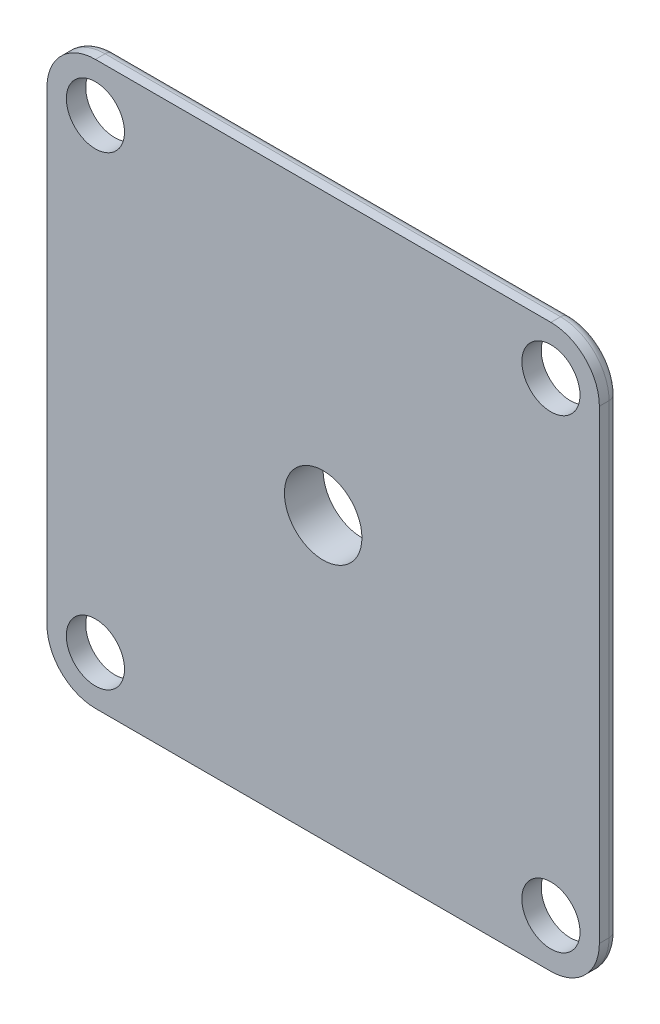
ISO-10303-21;
HEADER;
FILE_DESCRIPTION(('STEP AP214'),'2;1');
FILE_NAME('part.step','',(''),(''),'','','');
FILE_SCHEMA(('AUTOMOTIVE_DESIGN { 1 0 10303 214 1 1 1 1 }'));
ENDSEC;
DATA;
#1=APPLICATION_CONTEXT('core data for automotive mechanical design processes');
#2=APPLICATION_PROTOCOL_DEFINITION('international standard','automotive_design',2000,#1);
#3=PRODUCT_CONTEXT('',#1,'mechanical');
#4=PRODUCT('Part','Part','',(#3));
#5=PRODUCT_RELATED_PRODUCT_CATEGORY('part','',(#4));
#6=PRODUCT_DEFINITION_FORMATION('','',#4);
#7=PRODUCT_DEFINITION_CONTEXT('part definition',#1,'design');
#8=PRODUCT_DEFINITION('design','',#6,#7);
#9=PRODUCT_DEFINITION_SHAPE('','',#8);
#10=(LENGTH_UNIT() NAMED_UNIT(*) SI_UNIT(.MILLI.,.METRE.));
#11=(NAMED_UNIT(*) PLANE_ANGLE_UNIT() SI_UNIT($,.RADIAN.));
#12=(NAMED_UNIT(*) SI_UNIT($,.STERADIAN.) SOLID_ANGLE_UNIT());
#13=UNCERTAINTY_MEASURE_WITH_UNIT(LENGTH_MEASURE(1.E-05),#10,'distance_accuracy_value','');
#14=(GEOMETRIC_REPRESENTATION_CONTEXT(3) GLOBAL_UNCERTAINTY_ASSIGNED_CONTEXT((#13)) GLOBAL_UNIT_ASSIGNED_CONTEXT((#10,
#11,#12)) REPRESENTATION_CONTEXT('',''));
#15=CARTESIAN_POINT('',(0.,0.,0.));
#16=DIRECTION('',(0.,0.,1.));
#17=DIRECTION('',(1.,0.,0.));
#18=AXIS2_PLACEMENT_3D('',#15,#16,#17);
#19=CARTESIAN_POINT('',(14.,0.,16.));
#20=DIRECTION('',(0.,0.,1.));
#21=DIRECTION('',(1.,0.,0.));
#22=AXIS2_PLACEMENT_3D('',#19,#20,#21);
#23=CYLINDRICAL_SURFACE('',#22,10.);
#24=CARTESIAN_POINT('',(14.,0.,18.));
#25=DIRECTION('',(0.,0.,1.));
#26=DIRECTION('',(1.,0.,0.));
#27=AXIS2_PLACEMENT_3D('',#24,#25,#26);
#28=CIRCLE('',#27,10.);
#29=CARTESIAN_POINT('',(24.,0.,18.));
#30=VERTEX_POINT('',#29);
#31=EDGE_CURVE('E20',#30,#30,#28,.T.);
#32=ORIENTED_EDGE('',*,*,#31,.F.);
#33=EDGE_LOOP('',(#32));
#34=FACE_BOUND('',#33,.T.);
#35=CARTESIAN_POINT('',(14.,0.,17.));
#36=DIRECTION('',(0.,0.,1.));
#37=DIRECTION('',(1.,0.,0.));
#38=AXIS2_PLACEMENT_3D('',#35,#36,#37);
#39=CIRCLE('',#38,10.);
#40=CARTESIAN_POINT('',(24.,0.,17.));
#41=VERTEX_POINT('',#40);
#42=EDGE_CURVE('E196',#41,#41,#39,.F.);
#43=ORIENTED_EDGE('',*,*,#42,.F.);
#44=EDGE_LOOP('',(#43));
#45=FACE_BOUND('',#44,.T.);
#46=ADVANCED_FACE('F17',(#34,#45),#23,.T.);
#47=CARTESIAN_POINT('',(14.,0.,17.));
#48=DIRECTION('',(0.,0.,1.));
#49=DIRECTION('',(1.,0.,0.));
#50=AXIS2_PLACEMENT_3D('',#47,#48,#49);
#51=CONICAL_SURFACE('',#50,10.,0.785398163397448);
#52=ORIENTED_EDGE('',*,*,#42,.T.);
#53=EDGE_LOOP('',(#52));
#54=FACE_BOUND('',#53,.T.);
#55=CARTESIAN_POINT('',(14.,0.,16.));
#56=DIRECTION('',(0.,0.,1.));
#57=DIRECTION('',(1.,0.,0.));
#58=AXIS2_PLACEMENT_3D('',#55,#56,#57);
#59=CIRCLE('',#58,9.00000000000001);
#60=CARTESIAN_POINT('',(23.,0.,16.));
#61=VERTEX_POINT('',#60);
#62=EDGE_CURVE('E116',#61,#61,#59,.F.);
#63=ORIENTED_EDGE('',*,*,#62,.F.);
#64=EDGE_LOOP('',(#63));
#65=FACE_BOUND('',#64,.T.);
#66=ADVANCED_FACE('F445',(#54,#65),#51,.T.);
#67=CARTESIAN_POINT('',(41.5,24.,19.));
#68=DIRECTION('',(0.,1.,0.));
#69=DIRECTION('',(0.,0.,1.));
#70=AXIS2_PLACEMENT_3D('',#67,#68,#69);
#71=CYLINDRICAL_SURFACE('',#70,1.);
#72=CARTESIAN_POINT('',(41.5,24.,19.));
#73=DIRECTION('',(0.,-1.,0.));
#74=DIRECTION('',(1.,0.,0.));
#75=AXIS2_PLACEMENT_3D('',#72,#73,#74);
#76=CIRCLE('',#75,1.);
#77=CARTESIAN_POINT('',(42.5,24.,19.));
#78=VERTEX_POINT('',#77);
#79=CARTESIAN_POINT('',(41.5,24.,18.));
#80=VERTEX_POINT('',#79);
#81=EDGE_CURVE('E160',#78,#80,#76,.F.);
#82=ORIENTED_EDGE('',*,*,#81,.F.);
#83=DIRECTION('',(0.,1.,0.));
#84=VECTOR('',#83,1.);
#85=CARTESIAN_POINT('',(42.5,24.,19.));
#86=LINE('',#85,#84);
#87=CARTESIAN_POINT('',(42.5,-24.,19.));
#88=VERTEX_POINT('',#87);
#89=EDGE_CURVE('E113',#78,#88,#86,.F.);
#90=ORIENTED_EDGE('',*,*,#89,.T.);
#91=CARTESIAN_POINT('',(41.5,-24.,19.));
#92=DIRECTION('',(0.,-1.,0.));
#93=DIRECTION('',(1.,0.,0.));
#94=AXIS2_PLACEMENT_3D('',#91,#92,#93);
#95=CIRCLE('',#94,1.);
#96=CARTESIAN_POINT('',(41.5,-24.,18.));
#97=VERTEX_POINT('',#96);
#98=EDGE_CURVE('E203',#97,#88,#95,.T.);
#99=ORIENTED_EDGE('',*,*,#98,.F.);
#100=DIRECTION('',(0.,1.,0.));
#101=VECTOR('',#100,1.);
#102=CARTESIAN_POINT('',(41.5,24.,18.));
#103=LINE('',#102,#101);
#104=EDGE_CURVE('E152',#80,#97,#103,.F.);
#105=ORIENTED_EDGE('',*,*,#104,.F.);
#106=EDGE_LOOP('',(#82,#90,#99,#105));
#107=FACE_BOUND('',#106,.T.);
#108=ADVANCED_FACE('F388',(#107),#71,.T.);
#109=CARTESIAN_POINT('',(37.5,-24.,19.));
#110=DIRECTION('',(0.,0.,-1.));
#111=DIRECTION('',(-1.,0.,0.));
#112=AXIS2_PLACEMENT_3D('',#109,#110,#111);
#113=TOROIDAL_SURFACE('',#112,4.,1.);
#114=ORIENTED_EDGE('',*,*,#98,.T.);
#115=CARTESIAN_POINT('',(37.5,-24.,19.));
#116=DIRECTION('',(0.,0.,1.));
#117=DIRECTION('',(1.,0.,0.));
#118=AXIS2_PLACEMENT_3D('',#115,#116,#117);
#119=CIRCLE('',#118,5.);
#120=CARTESIAN_POINT('',(37.5,-29.,19.));
#121=VERTEX_POINT('',#120);
#122=EDGE_CURVE('E254',#121,#88,#119,.T.);
#123=ORIENTED_EDGE('',*,*,#122,.F.);
#124=CARTESIAN_POINT('',(37.5,-28.,19.));
#125=DIRECTION('',(1.,0.,0.));
#126=DIRECTION('',(0.,1.,0.));
#127=AXIS2_PLACEMENT_3D('',#124,#125,#126);
#128=CIRCLE('',#127,1.);
#129=CARTESIAN_POINT('',(37.5,-28.,18.));
#130=VERTEX_POINT('',#129);
#131=EDGE_CURVE('E393',#130,#121,#128,.F.);
#132=ORIENTED_EDGE('',*,*,#131,.F.);
#133=CARTESIAN_POINT('',(37.5,-24.,18.));
#134=DIRECTION('',(0.,0.,1.));
#135=DIRECTION('',(0.,-1.,0.));
#136=AXIS2_PLACEMENT_3D('',#133,#134,#135);
#137=CIRCLE('',#136,4.);
#138=EDGE_CURVE('E149',#97,#130,#137,.F.);
#139=ORIENTED_EDGE('',*,*,#138,.F.);
#140=EDGE_LOOP('',(#114,#123,#132,#139));
#141=FACE_BOUND('',#140,.T.);
#142=ADVANCED_FACE('F378',(#141),#113,.T.);
#143=CARTESIAN_POINT('',(37.5,-28.,19.));
#144=DIRECTION('',(1.,0.,0.));
#145=DIRECTION('',(0.,1.,0.));
#146=AXIS2_PLACEMENT_3D('',#143,#144,#145);
#147=CYLINDRICAL_SURFACE('',#146,1.);
#148=ORIENTED_EDGE('',*,*,#131,.T.);
#149=DIRECTION('',(-1.,0.,0.));
#150=VECTOR('',#149,1.);
#151=CARTESIAN_POINT('',(37.5,-29.,19.));
#152=LINE('',#151,#150);
#153=CARTESIAN_POINT('',(-9.49999999999996,-29.,19.));
#154=VERTEX_POINT('',#153);
#155=EDGE_CURVE('E75',#121,#154,#152,.T.);
#156=ORIENTED_EDGE('',*,*,#155,.T.);
#157=CARTESIAN_POINT('',(-9.49999999999997,-28.,19.));
#158=DIRECTION('',(-1.,0.,0.));
#159=DIRECTION('',(0.,-1.,0.));
#160=AXIS2_PLACEMENT_3D('',#157,#158,#159);
#161=CIRCLE('',#160,1.);
#162=CARTESIAN_POINT('',(-9.49999999999997,-28.,18.));
#163=VERTEX_POINT('',#162);
#164=EDGE_CURVE('E310',#163,#154,#161,.T.);
#165=ORIENTED_EDGE('',*,*,#164,.F.);
#166=DIRECTION('',(-1.,0.,0.));
#167=VECTOR('',#166,1.);
#168=CARTESIAN_POINT('',(37.5,-28.,18.));
#169=LINE('',#168,#167);
#170=EDGE_CURVE('E139',#130,#163,#169,.T.);
#171=ORIENTED_EDGE('',*,*,#170,.F.);
#172=EDGE_LOOP('',(#148,#156,#165,#171));
#173=FACE_BOUND('',#172,.T.);
#174=ADVANCED_FACE('F364',(#173),#147,.T.);
#175=CARTESIAN_POINT('',(-9.49999999999999,-24.,19.));
#176=DIRECTION('',(0.,0.,-1.));
#177=DIRECTION('',(-1.,0.,0.));
#178=AXIS2_PLACEMENT_3D('',#175,#176,#177);
#179=TOROIDAL_SURFACE('',#178,4.,1.);
#180=CARTESIAN_POINT('',(-13.5,-24.,19.));
#181=DIRECTION('',(0.,-1.,0.));
#182=DIRECTION('',(0.,0.,-1.));
#183=AXIS2_PLACEMENT_3D('',#180,#181,#182);
#184=CIRCLE('',#183,1.);
#185=CARTESIAN_POINT('',(-13.5,-24.,18.));
#186=VERTEX_POINT('',#185);
#187=CARTESIAN_POINT('',(-14.5,-24.,19.));
#188=VERTEX_POINT('',#187);
#189=EDGE_CURVE('E302',#186,#188,#184,.F.);
#190=ORIENTED_EDGE('',*,*,#189,.F.);
#191=CARTESIAN_POINT('',(-9.49999999999999,-24.,18.));
#192=DIRECTION('',(0.,0.,1.));
#193=DIRECTION('',(-1.,0.,0.));
#194=AXIS2_PLACEMENT_3D('',#191,#192,#193);
#195=CIRCLE('',#194,4.);
#196=EDGE_CURVE('E133',#163,#186,#195,.F.);
#197=ORIENTED_EDGE('',*,*,#196,.F.);
#198=ORIENTED_EDGE('',*,*,#164,.T.);
#199=CARTESIAN_POINT('',(-9.49999999999999,-24.,19.));
#200=DIRECTION('',(0.,0.,1.));
#201=DIRECTION('',(1.,0.,0.));
#202=AXIS2_PLACEMENT_3D('',#199,#200,#201);
#203=CIRCLE('',#202,5.);
#204=EDGE_CURVE('E248',#188,#154,#203,.T.);
#205=ORIENTED_EDGE('',*,*,#204,.F.);
#206=EDGE_LOOP('',(#190,#197,#198,#205));
#207=FACE_BOUND('',#206,.T.);
#208=ADVANCED_FACE('F303',(#207),#179,.T.);
#209=CARTESIAN_POINT('',(-13.5,24.,19.));
#210=DIRECTION('',(0.,-1.,0.));
#211=DIRECTION('',(0.,0.,-1.));
#212=AXIS2_PLACEMENT_3D('',#209,#210,#211);
#213=CYLINDRICAL_SURFACE('',#212,1.);
#214=CARTESIAN_POINT('',(-13.5,24.,19.));
#215=DIRECTION('',(0.,1.,0.));
#216=DIRECTION('',(-1.,0.,0.));
#217=AXIS2_PLACEMENT_3D('',#214,#215,#216);
#218=CIRCLE('',#217,1.);
#219=CARTESIAN_POINT('',(-13.5,24.,18.));
#220=VERTEX_POINT('',#219);
#221=CARTESIAN_POINT('',(-14.5,24.,19.));
#222=VERTEX_POINT('',#221);
#223=EDGE_CURVE('E309',#220,#222,#218,.T.);
#224=ORIENTED_EDGE('',*,*,#223,.F.);
#225=DIRECTION('',(0.,1.,0.));
#226=VECTOR('',#225,1.);
#227=CARTESIAN_POINT('',(-13.5,24.,18.));
#228=LINE('',#227,#226);
#229=EDGE_CURVE('E125',#186,#220,#228,.T.);
#230=ORIENTED_EDGE('',*,*,#229,.F.);
#231=ORIENTED_EDGE('',*,*,#189,.T.);
#232=DIRECTION('',(0.,1.,0.));
#233=VECTOR('',#232,1.);
#234=CARTESIAN_POINT('',(-14.5,-24.,19.));
#235=LINE('',#234,#233);
#236=EDGE_CURVE('E243',#188,#222,#235,.T.);
#237=ORIENTED_EDGE('',*,*,#236,.T.);
#238=EDGE_LOOP('',(#224,#230,#231,#237));
#239=FACE_BOUND('',#238,.T.);
#240=ADVANCED_FACE('F312',(#239),#213,.T.);
#241=CARTESIAN_POINT('',(-9.49999999999999,24.,19.));
#242=DIRECTION('',(0.,0.,-1.));
#243=DIRECTION('',(-1.,0.,0.));
#244=AXIS2_PLACEMENT_3D('',#241,#242,#243);
#245=TOROIDAL_SURFACE('',#244,4.,1.);
#246=CARTESIAN_POINT('',(-9.49999999999996,28.,19.));
#247=DIRECTION('',(-1.,0.,0.));
#248=DIRECTION('',(0.,0.,1.));
#249=AXIS2_PLACEMENT_3D('',#246,#247,#248);
#250=CIRCLE('',#249,1.);
#251=CARTESIAN_POINT('',(-9.49999999999996,28.,18.));
#252=VERTEX_POINT('',#251);
#253=CARTESIAN_POINT('',(-9.49999999999996,29.,19.));
#254=VERTEX_POINT('',#253);
#255=EDGE_CURVE('E320',#252,#254,#250,.F.);
#256=ORIENTED_EDGE('',*,*,#255,.F.);
#257=CARTESIAN_POINT('',(-9.49999999999999,24.,18.));
#258=DIRECTION('',(0.,0.,1.));
#259=DIRECTION('',(0.,1.,0.));
#260=AXIS2_PLACEMENT_3D('',#257,#258,#259);
#261=CIRCLE('',#260,4.);
#262=EDGE_CURVE('E121',#220,#252,#261,.F.);
#263=ORIENTED_EDGE('',*,*,#262,.F.);
#264=ORIENTED_EDGE('',*,*,#223,.T.);
#265=CARTESIAN_POINT('',(-9.49999999999999,24.,19.));
#266=DIRECTION('',(0.,0.,1.));
#267=DIRECTION('',(1.,0.,0.));
#268=AXIS2_PLACEMENT_3D('',#265,#266,#267);
#269=CIRCLE('',#268,5.);
#270=EDGE_CURVE('E237',#254,#222,#269,.T.);
#271=ORIENTED_EDGE('',*,*,#270,.F.);
#272=EDGE_LOOP('',(#256,#263,#264,#271));
#273=FACE_BOUND('',#272,.T.);
#274=ADVANCED_FACE('F324',(#273),#245,.T.);
#275=CARTESIAN_POINT('',(37.5,28.,19.));
#276=DIRECTION('',(-1.,0.,0.));
#277=DIRECTION('',(0.,0.,1.));
#278=AXIS2_PLACEMENT_3D('',#275,#276,#277);
#279=CYLINDRICAL_SURFACE('',#278,1.);
#280=CARTESIAN_POINT('',(37.5,28.,19.));
#281=DIRECTION('',(1.,0.,0.));
#282=DIRECTION('',(0.,1.,0.));
#283=AXIS2_PLACEMENT_3D('',#280,#281,#282);
#284=CIRCLE('',#283,1.);
#285=CARTESIAN_POINT('',(37.5,28.,18.));
#286=VERTEX_POINT('',#285);
#287=CARTESIAN_POINT('',(37.5,29.,19.));
#288=VERTEX_POINT('',#287);
#289=EDGE_CURVE('E176',#286,#288,#284,.T.);
#290=ORIENTED_EDGE('',*,*,#289,.F.);
#291=DIRECTION('',(-1.,0.,0.));
#292=VECTOR('',#291,1.);
#293=CARTESIAN_POINT('',(37.5,28.,18.));
#294=LINE('',#293,#292);
#295=EDGE_CURVE('E158',#252,#286,#294,.F.);
#296=ORIENTED_EDGE('',*,*,#295,.F.);
#297=ORIENTED_EDGE('',*,*,#255,.T.);
#298=DIRECTION('',(1.,0.,0.));
#299=VECTOR('',#298,1.);
#300=CARTESIAN_POINT('',(-9.49999999999996,29.,19.));
#301=LINE('',#300,#299);
#302=EDGE_CURVE('E163',#254,#288,#301,.T.);
#303=ORIENTED_EDGE('',*,*,#302,.T.);
#304=EDGE_LOOP('',(#290,#296,#297,#303));
#305=FACE_BOUND('',#304,.T.);
#306=ADVANCED_FACE('F184',(#305),#279,.T.);
#307=CARTESIAN_POINT('',(37.5,24.,19.));
#308=DIRECTION('',(0.,0.,-1.));
#309=DIRECTION('',(-1.,0.,0.));
#310=AXIS2_PLACEMENT_3D('',#307,#308,#309);
#311=TOROIDAL_SURFACE('',#310,4.,1.);
#312=ORIENTED_EDGE('',*,*,#81,.T.);
#313=CARTESIAN_POINT('',(37.5,24.,18.));
#314=DIRECTION('',(0.,0.,1.));
#315=DIRECTION('',(1.,0.,0.));
#316=AXIS2_PLACEMENT_3D('',#313,#314,#315);
#317=CIRCLE('',#316,4.);
#318=EDGE_CURVE('E155',#286,#80,#317,.F.);
#319=ORIENTED_EDGE('',*,*,#318,.F.);
#320=ORIENTED_EDGE('',*,*,#289,.T.);
#321=CARTESIAN_POINT('',(37.5,24.,19.));
#322=DIRECTION('',(0.,0.,1.));
#323=DIRECTION('',(1.,0.,0.));
#324=AXIS2_PLACEMENT_3D('',#321,#322,#323);
#325=CIRCLE('',#324,5.);
#326=EDGE_CURVE('E170',#78,#288,#325,.T.);
#327=ORIENTED_EDGE('',*,*,#326,.F.);
#328=EDGE_LOOP('',(#312,#319,#320,#327));
#329=FACE_BOUND('',#328,.T.);
#330=ADVANCED_FACE('F179',(#329),#311,.T.);
#331=CARTESIAN_POINT('',(37.5,24.,18.));
#332=DIRECTION('',(0.,0.,-1.));
#333=DIRECTION('',(-1.,0.,0.));
#334=AXIS2_PLACEMENT_3D('',#331,#332,#333);
#335=PLANE('',#334);
#336=ORIENTED_EDGE('',*,*,#31,.T.);
#337=EDGE_LOOP('',(#336));
#338=FACE_BOUND('',#337,.T.);
#339=CARTESIAN_POINT('',(-9.49999999999999,-24.,18.));
#340=DIRECTION('',(0.,0.,1.));
#341=DIRECTION('',(1.,0.,0.));
#342=AXIS2_PLACEMENT_3D('',#339,#340,#341);
#343=CIRCLE('',#342,3.);
#344=CARTESIAN_POINT('',(-6.5,-24.,18.));
#345=VERTEX_POINT('',#344);
#346=EDGE_CURVE('E114',#345,#345,#343,.T.);
#347=ORIENTED_EDGE('',*,*,#346,.T.);
#348=EDGE_LOOP('',(#347));
#349=FACE_BOUND('',#348,.T.);
#350=CARTESIAN_POINT('',(37.5,24.,18.));
#351=DIRECTION('',(0.,0.,1.));
#352=DIRECTION('',(1.,0.,0.));
#353=AXIS2_PLACEMENT_3D('',#350,#351,#352);
#354=CIRCLE('',#353,3.);
#355=CARTESIAN_POINT('',(40.5,24.,18.));
#356=VERTEX_POINT('',#355);
#357=EDGE_CURVE('E110',#356,#356,#354,.T.);
#358=ORIENTED_EDGE('',*,*,#357,.T.);
#359=EDGE_LOOP('',(#358));
#360=FACE_BOUND('',#359,.T.);
#361=CARTESIAN_POINT('',(-9.49999999999999,24.,18.));
#362=DIRECTION('',(0.,0.,1.));
#363=DIRECTION('',(1.,0.,0.));
#364=AXIS2_PLACEMENT_3D('',#361,#362,#363);
#365=CIRCLE('',#364,3.);
#366=CARTESIAN_POINT('',(-6.49999999999999,24.,18.));
#367=VERTEX_POINT('',#366);
#368=EDGE_CURVE('E107',#367,#367,#365,.T.);
#369=ORIENTED_EDGE('',*,*,#368,.T.);
#370=EDGE_LOOP('',(#369));
#371=FACE_BOUND('',#370,.T.);
#372=CARTESIAN_POINT('',(37.5,-24.,18.));
#373=DIRECTION('',(0.,0.,1.));
#374=DIRECTION('',(1.,0.,0.));
#375=AXIS2_PLACEMENT_3D('',#372,#373,#374);
#376=CIRCLE('',#375,3.);
#377=CARTESIAN_POINT('',(40.5,-24.,18.));
#378=VERTEX_POINT('',#377);
#379=EDGE_CURVE('E104',#378,#378,#376,.T.);
#380=ORIENTED_EDGE('',*,*,#379,.T.);
#381=EDGE_LOOP('',(#380));
#382=FACE_BOUND('',#381,.T.);
#383=ORIENTED_EDGE('',*,*,#229,.T.);
#384=ORIENTED_EDGE('',*,*,#262,.T.);
#385=ORIENTED_EDGE('',*,*,#295,.T.);
#386=ORIENTED_EDGE('',*,*,#318,.T.);
#387=ORIENTED_EDGE('',*,*,#104,.T.);
#388=ORIENTED_EDGE('',*,*,#138,.T.);
#389=ORIENTED_EDGE('',*,*,#170,.T.);
#390=ORIENTED_EDGE('',*,*,#196,.T.);
#391=EDGE_LOOP('',(#383,#384,#385,#386,#387,#388,#389,#390));
#392=FACE_BOUND('',#391,.T.);
#393=ADVANCED_FACE('F183',(#338,#349,#360,#371,#382,#392),#335,.T.);
#394=CARTESIAN_POINT('',(14.,0.,16.));
#395=DIRECTION('',(0.,0.,-1.));
#396=DIRECTION('',(-1.,0.,0.));
#397=AXIS2_PLACEMENT_3D('',#394,#395,#396);
#398=PLANE('',#397);
#399=CARTESIAN_POINT('',(14.,0.,16.));
#400=DIRECTION('',(0.,0.,1.));
#401=DIRECTION('',(1.,0.,0.));
#402=AXIS2_PLACEMENT_3D('',#399,#400,#401);
#403=CIRCLE('',#402,4.);
#404=CARTESIAN_POINT('',(18.,0.,16.));
#405=VERTEX_POINT('',#404);
#406=EDGE_CURVE('E101',#405,#405,#403,.T.);
#407=ORIENTED_EDGE('',*,*,#406,.T.);
#408=EDGE_LOOP('',(#407));
#409=FACE_BOUND('',#408,.T.);
#410=ORIENTED_EDGE('',*,*,#62,.T.);
#411=EDGE_LOOP('',(#410));
#412=FACE_BOUND('',#411,.T.);
#413=ADVANCED_FACE('F499',(#409,#412),#398,.T.);
#414=CARTESIAN_POINT('',(-9.49999999999999,-24.,18.));
#415=DIRECTION('',(0.,0.,1.));
#416=DIRECTION('',(1.,0.,0.));
#417=AXIS2_PLACEMENT_3D('',#414,#415,#416);
#418=CYLINDRICAL_SURFACE('',#417,3.);
#419=CARTESIAN_POINT('',(-9.49999999999999,-24.,20.));
#420=DIRECTION('',(0.,0.,1.));
#421=DIRECTION('',(1.,0.,0.));
#422=AXIS2_PLACEMENT_3D('',#419,#420,#421);
#423=CIRCLE('',#422,3.);
#424=CARTESIAN_POINT('',(-6.5,-24.,20.));
#425=VERTEX_POINT('',#424);
#426=EDGE_CURVE('E98',#425,#425,#423,.T.);
#427=ORIENTED_EDGE('',*,*,#426,.T.);
#428=EDGE_LOOP('',(#427));
#429=FACE_BOUND('',#428,.T.);
#430=ORIENTED_EDGE('',*,*,#346,.F.);
#431=EDGE_LOOP('',(#430));
#432=FACE_BOUND('',#431,.T.);
#433=ADVANCED_FACE('F496',(#429,#432),#418,.F.);
#434=CARTESIAN_POINT('',(37.5,24.,18.));
#435=DIRECTION('',(0.,0.,1.));
#436=DIRECTION('',(1.,0.,0.));
#437=AXIS2_PLACEMENT_3D('',#434,#435,#436);
#438=CYLINDRICAL_SURFACE('',#437,3.);
#439=CARTESIAN_POINT('',(37.5,24.,20.));
#440=DIRECTION('',(0.,0.,1.));
#441=DIRECTION('',(1.,0.,0.));
#442=AXIS2_PLACEMENT_3D('',#439,#440,#441);
#443=CIRCLE('',#442,3.);
#444=CARTESIAN_POINT('',(40.5,24.,20.));
#445=VERTEX_POINT('',#444);
#446=EDGE_CURVE('E91',#445,#445,#443,.T.);
#447=ORIENTED_EDGE('',*,*,#446,.T.);
#448=EDGE_LOOP('',(#447));
#449=FACE_BOUND('',#448,.T.);
#450=ORIENTED_EDGE('',*,*,#357,.F.);
#451=EDGE_LOOP('',(#450));
#452=FACE_BOUND('',#451,.T.);
#453=ADVANCED_FACE('F492',(#449,#452),#438,.F.);
#454=CARTESIAN_POINT('',(42.5,24.,18.));
#455=DIRECTION('',(-1.,0.,0.));
#456=DIRECTION('',(0.,0.,1.));
#457=AXIS2_PLACEMENT_3D('',#454,#455,#456);
#458=PLANE('',#457);
#459=ORIENTED_EDGE('',*,*,#89,.F.);
#460=DIRECTION('',(0.,0.,1.));
#461=VECTOR('',#460,1.);
#462=CARTESIAN_POINT('',(42.5,24.,18.));
#463=LINE('',#462,#461);
#464=CARTESIAN_POINT('',(42.5,24.,20.));
#465=VERTEX_POINT('',#464);
#466=EDGE_CURVE('E166',#465,#78,#463,.F.);
#467=ORIENTED_EDGE('',*,*,#466,.F.);
#468=DIRECTION('',(0.,1.,0.));
#469=VECTOR('',#468,1.);
#470=CARTESIAN_POINT('',(42.5,24.,20.));
#471=LINE('',#470,#469);
#472=CARTESIAN_POINT('',(42.5,-24.,20.));
#473=VERTEX_POINT('',#472);
#474=EDGE_CURVE('E89',#465,#473,#471,.F.);
#475=ORIENTED_EDGE('',*,*,#474,.T.);
#476=DIRECTION('',(0.,0.,1.));
#477=VECTOR('',#476,1.);
#478=CARTESIAN_POINT('',(42.5,-24.,18.));
#479=LINE('',#478,#477);
#480=EDGE_CURVE('E61',#88,#473,#479,.T.);
#481=ORIENTED_EDGE('',*,*,#480,.F.);
#482=EDGE_LOOP('',(#459,#467,#475,#481));
#483=FACE_BOUND('',#482,.T.);
#484=ADVANCED_FACE('F489',(#483),#458,.F.);
#485=CARTESIAN_POINT('',(37.5,-24.,18.));
#486=DIRECTION('',(0.,0.,1.));
#487=DIRECTION('',(1.,0.,0.));
#488=AXIS2_PLACEMENT_3D('',#485,#486,#487);
#489=CYLINDRICAL_SURFACE('',#488,5.);
#490=ORIENTED_EDGE('',*,*,#480,.T.);
#491=CARTESIAN_POINT('',(37.5,-24.,20.));
#492=DIRECTION('',(0.,0.,1.));
#493=DIRECTION('',(1.,0.,0.));
#494=AXIS2_PLACEMENT_3D('',#491,#492,#493);
#495=CIRCLE('',#494,5.);
#496=CARTESIAN_POINT('',(37.5,-29.,20.));
#497=VERTEX_POINT('',#496);
#498=EDGE_CURVE('E82',#473,#497,#495,.F.);
#499=ORIENTED_EDGE('',*,*,#498,.T.);
#500=DIRECTION('',(0.,0.,1.));
#501=VECTOR('',#500,1.);
#502=CARTESIAN_POINT('',(37.5,-29.,18.));
#503=LINE('',#502,#501);
#504=EDGE_CURVE('E68',#497,#121,#503,.F.);
#505=ORIENTED_EDGE('',*,*,#504,.T.);
#506=ORIENTED_EDGE('',*,*,#122,.T.);
#507=EDGE_LOOP('',(#490,#499,#505,#506));
#508=FACE_BOUND('',#507,.T.);
#509=ADVANCED_FACE('F88',(#508),#489,.T.);
#510=CARTESIAN_POINT('',(37.5,-29.,18.));
#511=DIRECTION('',(0.,1.,0.));
#512=DIRECTION('',(-1.,0.,0.));
#513=AXIS2_PLACEMENT_3D('',#510,#511,#512);
#514=PLANE('',#513);
#515=ORIENTED_EDGE('',*,*,#155,.F.);
#516=ORIENTED_EDGE('',*,*,#504,.F.);
#517=DIRECTION('',(-1.,0.,0.));
#518=VECTOR('',#517,1.);
#519=CARTESIAN_POINT('',(37.5,-29.,20.));
#520=LINE('',#519,#518);
#521=CARTESIAN_POINT('',(-9.49999999999998,-29.,20.));
#522=VERTEX_POINT('',#521);
#523=EDGE_CURVE('E72',#497,#522,#520,.T.);
#524=ORIENTED_EDGE('',*,*,#523,.T.);
#525=DIRECTION('',(0.,0.,1.));
#526=VECTOR('',#525,1.);
#527=CARTESIAN_POINT('',(-9.49999999999996,-29.,18.));
#528=LINE('',#527,#526);
#529=EDGE_CURVE('E244',#154,#522,#528,.T.);
#530=ORIENTED_EDGE('',*,*,#529,.F.);
#531=EDGE_LOOP('',(#515,#516,#524,#530));
#532=FACE_BOUND('',#531,.T.);
#533=ADVANCED_FACE('F70',(#532),#514,.F.);
#534=CARTESIAN_POINT('',(-9.49999999999999,-24.,18.));
#535=DIRECTION('',(0.,0.,1.));
#536=DIRECTION('',(1.,0.,0.));
#537=AXIS2_PLACEMENT_3D('',#534,#535,#536);
#538=CYLINDRICAL_SURFACE('',#537,5.);
#539=ORIENTED_EDGE('',*,*,#529,.T.);
#540=CARTESIAN_POINT('',(-9.49999999999999,-24.,20.));
#541=DIRECTION('',(0.,0.,1.));
#542=DIRECTION('',(1.,0.,0.));
#543=AXIS2_PLACEMENT_3D('',#540,#541,#542);
#544=CIRCLE('',#543,5.);
#545=CARTESIAN_POINT('',(-14.5,-24.,20.));
#546=VERTEX_POINT('',#545);
#547=EDGE_CURVE('E86',#522,#546,#544,.F.);
#548=ORIENTED_EDGE('',*,*,#547,.T.);
#549=DIRECTION('',(0.,0.,-1.));
#550=VECTOR('',#549,1.);
#551=CARTESIAN_POINT('',(-14.5,-24.,18.));
#552=LINE('',#551,#550);
#553=EDGE_CURVE('E240',#546,#188,#552,.T.);
#554=ORIENTED_EDGE('',*,*,#553,.T.);
#555=ORIENTED_EDGE('',*,*,#204,.T.);
#556=EDGE_LOOP('',(#539,#548,#554,#555));
#557=FACE_BOUND('',#556,.T.);
#558=ADVANCED_FACE('F481',(#557),#538,.T.);
#559=CARTESIAN_POINT('',(-14.5,-24.,18.));
#560=DIRECTION('',(1.,0.,0.));
#561=DIRECTION('',(0.,0.,-1.));
#562=AXIS2_PLACEMENT_3D('',#559,#560,#561);
#563=PLANE('',#562);
#564=ORIENTED_EDGE('',*,*,#236,.F.);
#565=ORIENTED_EDGE('',*,*,#553,.F.);
#566=DIRECTION('',(0.,1.,0.));
#567=VECTOR('',#566,1.);
#568=CARTESIAN_POINT('',(-14.5,24.,20.));
#569=LINE('',#568,#567);
#570=CARTESIAN_POINT('',(-14.5,24.,20.));
#571=VERTEX_POINT('',#570);
#572=EDGE_CURVE('E214',#546,#571,#569,.T.);
#573=ORIENTED_EDGE('',*,*,#572,.T.);
#574=DIRECTION('',(0.,0.,1.));
#575=VECTOR('',#574,1.);
#576=CARTESIAN_POINT('',(-14.5,24.,18.));
#577=LINE('',#576,#575);
#578=EDGE_CURVE('E233',#222,#571,#577,.T.);
#579=ORIENTED_EDGE('',*,*,#578,.F.);
#580=EDGE_LOOP('',(#564,#565,#573,#579));
#581=FACE_BOUND('',#580,.T.);
#582=ADVANCED_FACE('F478',(#581),#563,.F.);
#583=CARTESIAN_POINT('',(-9.49999999999999,24.,18.));
#584=DIRECTION('',(0.,0.,1.));
#585=DIRECTION('',(1.,0.,0.));
#586=AXIS2_PLACEMENT_3D('',#583,#584,#585);
#587=CYLINDRICAL_SURFACE('',#586,5.);
#588=ORIENTED_EDGE('',*,*,#578,.T.);
#589=CARTESIAN_POINT('',(-9.49999999999999,24.,20.));
#590=DIRECTION('',(0.,0.,1.));
#591=DIRECTION('',(1.,0.,0.));
#592=AXIS2_PLACEMENT_3D('',#589,#590,#591);
#593=CIRCLE('',#592,5.);
#594=CARTESIAN_POINT('',(-9.49999999999998,29.,20.));
#595=VERTEX_POINT('',#594);
#596=EDGE_CURVE('E212',#571,#595,#593,.F.);
#597=ORIENTED_EDGE('',*,*,#596,.T.);
#598=DIRECTION('',(0.,0.,-1.));
#599=VECTOR('',#598,1.);
#600=CARTESIAN_POINT('',(-9.49999999999996,29.,18.));
#601=LINE('',#600,#599);
#602=EDGE_CURVE('E167',#595,#254,#601,.T.);
#603=ORIENTED_EDGE('',*,*,#602,.T.);
#604=ORIENTED_EDGE('',*,*,#270,.T.);
#605=EDGE_LOOP('',(#588,#597,#603,#604));
#606=FACE_BOUND('',#605,.T.);
#607=ADVANCED_FACE('F418',(#606),#587,.T.);
#608=CARTESIAN_POINT('',(-9.49999999999996,29.,18.));
#609=DIRECTION('',(0.,-1.,0.));
#610=DIRECTION('',(0.,0.,-1.));
#611=AXIS2_PLACEMENT_3D('',#608,#609,#610);
#612=PLANE('',#611);
#613=ORIENTED_EDGE('',*,*,#302,.F.);
#614=ORIENTED_EDGE('',*,*,#602,.F.);
#615=DIRECTION('',(-1.,0.,0.));
#616=VECTOR('',#615,1.);
#617=CARTESIAN_POINT('',(37.5,29.,20.));
#618=LINE('',#617,#616);
#619=CARTESIAN_POINT('',(37.5,29.,20.));
#620=VERTEX_POINT('',#619);
#621=EDGE_CURVE('E211',#595,#620,#618,.F.);
#622=ORIENTED_EDGE('',*,*,#621,.T.);
#623=DIRECTION('',(0.,0.,1.));
#624=VECTOR('',#623,1.);
#625=CARTESIAN_POINT('',(37.5,29.,18.));
#626=LINE('',#625,#624);
#627=EDGE_CURVE('E35',#288,#620,#626,.T.);
#628=ORIENTED_EDGE('',*,*,#627,.F.);
#629=EDGE_LOOP('',(#613,#614,#622,#628));
#630=FACE_BOUND('',#629,.T.);
#631=ADVANCED_FACE('F425',(#630),#612,.F.);
#632=CARTESIAN_POINT('',(37.5,24.,18.));
#633=DIRECTION('',(0.,0.,1.));
#634=DIRECTION('',(1.,0.,0.));
#635=AXIS2_PLACEMENT_3D('',#632,#633,#634);
#636=CYLINDRICAL_SURFACE('',#635,5.);
#637=ORIENTED_EDGE('',*,*,#627,.T.);
#638=CARTESIAN_POINT('',(37.5,24.,20.));
#639=DIRECTION('',(0.,0.,1.));
#640=DIRECTION('',(1.,0.,0.));
#641=AXIS2_PLACEMENT_3D('',#638,#639,#640);
#642=CIRCLE('',#641,5.);
#643=EDGE_CURVE('E210',#620,#465,#642,.F.);
#644=ORIENTED_EDGE('',*,*,#643,.T.);
#645=ORIENTED_EDGE('',*,*,#466,.T.);
#646=ORIENTED_EDGE('',*,*,#326,.T.);
#647=EDGE_LOOP('',(#637,#644,#645,#646));
#648=FACE_BOUND('',#647,.T.);
#649=ADVANCED_FACE('F470',(#648),#636,.T.);
#650=CARTESIAN_POINT('',(-9.49999999999999,24.,18.));
#651=DIRECTION('',(0.,0.,1.));
#652=DIRECTION('',(1.,0.,0.));
#653=AXIS2_PLACEMENT_3D('',#650,#651,#652);
#654=CYLINDRICAL_SURFACE('',#653,3.);
#655=CARTESIAN_POINT('',(-9.49999999999999,24.,20.));
#656=DIRECTION('',(0.,0.,1.));
#657=DIRECTION('',(1.,0.,0.));
#658=AXIS2_PLACEMENT_3D('',#655,#656,#657);
#659=CIRCLE('',#658,3.);
#660=CARTESIAN_POINT('',(-6.49999999999999,24.,20.));
#661=VERTEX_POINT('',#660);
#662=EDGE_CURVE('E207',#661,#661,#659,.T.);
#663=ORIENTED_EDGE('',*,*,#662,.T.);
#664=EDGE_LOOP('',(#663));
#665=FACE_BOUND('',#664,.T.);
#666=ORIENTED_EDGE('',*,*,#368,.F.);
#667=EDGE_LOOP('',(#666));
#668=FACE_BOUND('',#667,.T.);
#669=ADVANCED_FACE('F466',(#665,#668),#654,.F.);
#670=CARTESIAN_POINT('',(37.5,-24.,18.));
#671=DIRECTION('',(0.,0.,1.));
#672=DIRECTION('',(1.,0.,0.));
#673=AXIS2_PLACEMENT_3D('',#670,#671,#672);
#674=CYLINDRICAL_SURFACE('',#673,3.);
#675=CARTESIAN_POINT('',(37.5,-24.,20.));
#676=DIRECTION('',(0.,0.,1.));
#677=DIRECTION('',(1.,0.,0.));
#678=AXIS2_PLACEMENT_3D('',#675,#676,#677);
#679=CIRCLE('',#678,3.);
#680=CARTESIAN_POINT('',(40.5,-24.,20.));
#681=VERTEX_POINT('',#680);
#682=EDGE_CURVE('E26',#681,#681,#679,.T.);
#683=ORIENTED_EDGE('',*,*,#682,.T.);
#684=EDGE_LOOP('',(#683));
#685=FACE_BOUND('',#684,.T.);
#686=ORIENTED_EDGE('',*,*,#379,.F.);
#687=EDGE_LOOP('',(#686));
#688=FACE_BOUND('',#687,.T.);
#689=ADVANCED_FACE('F458',(#685,#688),#674,.F.);
#690=CARTESIAN_POINT('',(14.,0.,18.));
#691=DIRECTION('',(0.,0.,1.));
#692=DIRECTION('',(1.,0.,0.));
#693=AXIS2_PLACEMENT_3D('',#690,#691,#692);
#694=CYLINDRICAL_SURFACE('',#693,4.);
#695=CARTESIAN_POINT('',(14.,0.,20.));
#696=DIRECTION('',(0.,0.,1.));
#697=DIRECTION('',(1.,0.,0.));
#698=AXIS2_PLACEMENT_3D('',#695,#696,#697);
#699=CIRCLE('',#698,4.);
#700=CARTESIAN_POINT('',(18.,0.,20.));
#701=VERTEX_POINT('',#700);
#702=EDGE_CURVE('E11',#701,#701,#699,.T.);
#703=ORIENTED_EDGE('',*,*,#702,.T.);
#704=EDGE_LOOP('',(#703));
#705=FACE_BOUND('',#704,.T.);
#706=ORIENTED_EDGE('',*,*,#406,.F.);
#707=EDGE_LOOP('',(#706));
#708=FACE_BOUND('',#707,.T.);
#709=ADVANCED_FACE('F452',(#705,#708),#694,.F.);
#710=CARTESIAN_POINT('',(37.5,24.,20.));
#711=DIRECTION('',(0.,0.,-1.));
#712=DIRECTION('',(-1.,0.,0.));
#713=AXIS2_PLACEMENT_3D('',#710,#711,#712);
#714=PLANE('',#713);
#715=ORIENTED_EDGE('',*,*,#702,.F.);
#716=EDGE_LOOP('',(#715));
#717=FACE_BOUND('',#716,.T.);
#718=ORIENTED_EDGE('',*,*,#682,.F.);
#719=EDGE_LOOP('',(#718));
#720=FACE_BOUND('',#719,.T.);
#721=ORIENTED_EDGE('',*,*,#662,.F.);
#722=EDGE_LOOP('',(#721));
#723=FACE_BOUND('',#722,.T.);
#724=ORIENTED_EDGE('',*,*,#621,.F.);
#725=ORIENTED_EDGE('',*,*,#596,.F.);
#726=ORIENTED_EDGE('',*,*,#572,.F.);
#727=ORIENTED_EDGE('',*,*,#547,.F.);
#728=ORIENTED_EDGE('',*,*,#523,.F.);
#729=ORIENTED_EDGE('',*,*,#498,.F.);
#730=ORIENTED_EDGE('',*,*,#474,.F.);
#731=ORIENTED_EDGE('',*,*,#643,.F.);
#732=EDGE_LOOP('',(#724,#725,#726,#727,#728,#729,#730,#731));
#733=FACE_BOUND('',#732,.T.);
#734=ORIENTED_EDGE('',*,*,#446,.F.);
#735=EDGE_LOOP('',(#734));
#736=FACE_BOUND('',#735,.T.);
#737=ORIENTED_EDGE('',*,*,#426,.F.);
#738=EDGE_LOOP('',(#737));
#739=FACE_BOUND('',#738,.T.);
#740=ADVANCED_FACE('F80',(#717,#720,#723,#733,#736,#739),#714,.F.);
#741=CLOSED_SHELL('',(#46,#66,#108,#142,#174,#208,#240,#274,#306,#330,#393,#413,#433,#453,#484,
#509,#533,#558,#582,#607,#631,#649,#669,#689,#709,#740));
#742=MANIFOLD_SOLID_BREP('B1',#741);
#743=ADVANCED_BREP_SHAPE_REPRESENTATION('',(#18,#742),#14);
#744=SHAPE_DEFINITION_REPRESENTATION(#9,#743);
ENDSEC;
END-ISO-10303-21;
